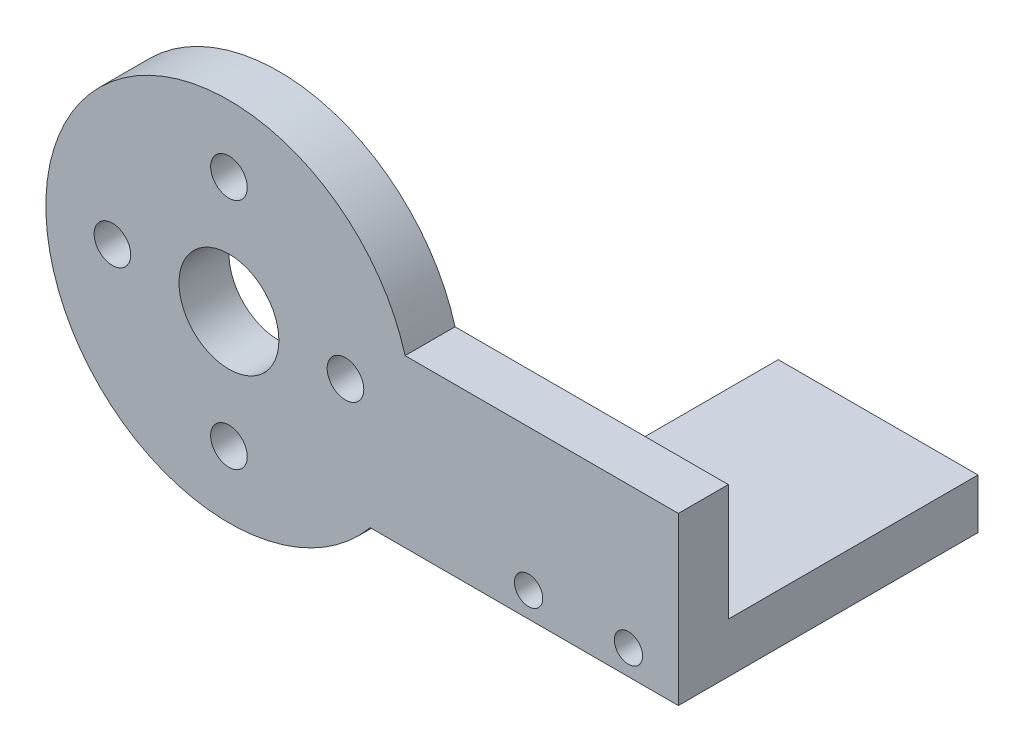
ISO-10303-21;
HEADER;
FILE_DESCRIPTION(('STEP AP214'),'2;1');
FILE_NAME('part.step','',(''),(''),'','','');
FILE_SCHEMA(('AUTOMOTIVE_DESIGN { 1 0 10303 214 1 1 1 1 }'));
ENDSEC;
DATA;
#1=APPLICATION_CONTEXT('core data for automotive mechanical design processes');
#2=APPLICATION_PROTOCOL_DEFINITION('international standard','automotive_design',2000,#1);
#3=PRODUCT_CONTEXT('',#1,'mechanical');
#4=PRODUCT('Part','Part','',(#3));
#5=PRODUCT_RELATED_PRODUCT_CATEGORY('part','',(#4));
#6=PRODUCT_DEFINITION_FORMATION('','',#4);
#7=PRODUCT_DEFINITION_CONTEXT('part definition',#1,'design');
#8=PRODUCT_DEFINITION('design','',#6,#7);
#9=PRODUCT_DEFINITION_SHAPE('','',#8);
#10=(LENGTH_UNIT() NAMED_UNIT(*) SI_UNIT(.MILLI.,.METRE.));
#11=(NAMED_UNIT(*) PLANE_ANGLE_UNIT() SI_UNIT($,.RADIAN.));
#12=(NAMED_UNIT(*) SI_UNIT($,.STERADIAN.) SOLID_ANGLE_UNIT());
#13=UNCERTAINTY_MEASURE_WITH_UNIT(LENGTH_MEASURE(1.E-05),#10,'distance_accuracy_value','');
#14=(GEOMETRIC_REPRESENTATION_CONTEXT(3) GLOBAL_UNCERTAINTY_ASSIGNED_CONTEXT((#13)) GLOBAL_UNIT_ASSIGNED_CONTEXT((#10,
#11,#12)) REPRESENTATION_CONTEXT('',''));
#15=CARTESIAN_POINT('',(0.,0.,0.));
#16=DIRECTION('',(0.,0.,1.));
#17=DIRECTION('',(1.,0.,0.));
#18=AXIS2_PLACEMENT_3D('',#15,#16,#17);
#19=CARTESIAN_POINT('',(0.,0.,15.));
#20=DIRECTION('',(0.,0.,1.));
#21=DIRECTION('',(1.,0.,0.));
#22=AXIS2_PLACEMENT_3D('',#19,#20,#21);
#23=PLANE('',#22);
#24=CARTESIAN_POINT('',(0.,-7.,15.));
#25=DIRECTION('',(0.,0.,1.));
#26=DIRECTION('',(1.,0.,0.));
#27=AXIS2_PLACEMENT_3D('',#24,#25,#26);
#28=CIRCLE('',#27,1.1);
#29=CARTESIAN_POINT('',(1.1,-7.,15.));
#30=VERTEX_POINT('',#29);
#31=EDGE_CURVE('E233',#30,#30,#28,.F.);
#32=ORIENTED_EDGE('',*,*,#31,.F.);
#33=EDGE_LOOP('',(#32));
#34=FACE_BOUND('',#33,.T.);
#35=CARTESIAN_POINT('',(0.,7.,15.));
#36=DIRECTION('',(0.,0.,1.));
#37=DIRECTION('',(1.,0.,0.));
#38=AXIS2_PLACEMENT_3D('',#35,#36,#37);
#39=CIRCLE('',#38,1.1);
#40=CARTESIAN_POINT('',(1.1,7.,15.));
#41=VERTEX_POINT('',#40);
#42=EDGE_CURVE('E227',#41,#41,#39,.F.);
#43=ORIENTED_EDGE('',*,*,#42,.F.);
#44=EDGE_LOOP('',(#43));
#45=FACE_BOUND('',#44,.T.);
#46=CARTESIAN_POINT('',(-7.,0.,15.));
#47=DIRECTION('',(0.,0.,1.));
#48=DIRECTION('',(1.,0.,0.));
#49=AXIS2_PLACEMENT_3D('',#46,#47,#48);
#50=CIRCLE('',#49,1.1);
#51=CARTESIAN_POINT('',(-5.9,0.,15.));
#52=VERTEX_POINT('',#51);
#53=EDGE_CURVE('E229',#52,#52,#50,.F.);
#54=ORIENTED_EDGE('',*,*,#53,.F.);
#55=EDGE_LOOP('',(#54));
#56=FACE_BOUND('',#55,.T.);
#57=CARTESIAN_POINT('',(7.,0.,15.));
#58=DIRECTION('',(0.,0.,1.));
#59=DIRECTION('',(1.,0.,0.));
#60=AXIS2_PLACEMENT_3D('',#57,#58,#59);
#61=CIRCLE('',#60,1.1);
#62=CARTESIAN_POINT('',(8.1,0.,15.));
#63=VERTEX_POINT('',#62);
#64=EDGE_CURVE('E211',#63,#63,#61,.F.);
#65=ORIENTED_EDGE('',*,*,#64,.F.);
#66=EDGE_LOOP('',(#65));
#67=FACE_BOUND('',#66,.T.);
#68=CARTESIAN_POINT('',(0.,0.,15.));
#69=DIRECTION('',(0.,0.,1.));
#70=DIRECTION('',(1.,0.,0.));
#71=AXIS2_PLACEMENT_3D('',#68,#69,#70);
#72=CIRCLE('',#71,3.);
#73=CARTESIAN_POINT('',(3.,0.,15.));
#74=VERTEX_POINT('',#73);
#75=EDGE_CURVE('E128',#74,#74,#72,.F.);
#76=ORIENTED_EDGE('',*,*,#75,.F.);
#77=EDGE_LOOP('',(#76));
#78=FACE_BOUND('',#77,.T.);
#79=DIRECTION('',(0.,1.,0.));
#80=VECTOR('',#79,1.);
#81=CARTESIAN_POINT('',(15.,0.,15.));
#82=LINE('',#81,#80);
#83=CARTESIAN_POINT('',(15.,-7.,15.));
#84=VERTEX_POINT('',#83);
#85=CARTESIAN_POINT('',(15.,-4.,15.));
#86=VERTEX_POINT('',#85);
#87=EDGE_CURVE('E11',#84,#86,#82,.T.);
#88=ORIENTED_EDGE('',*,*,#87,.F.);
#89=DIRECTION('',(1.,0.,0.));
#90=VECTOR('',#89,1.);
#91=CARTESIAN_POINT('',(0.,-7.,15.));
#92=LINE('',#91,#90);
#93=CARTESIAN_POINT('',(8.48528137423857,-7.,15.));
#94=VERTEX_POINT('',#93);
#95=EDGE_CURVE('E109',#94,#84,#92,.T.);
#96=ORIENTED_EDGE('',*,*,#95,.F.);
#97=CARTESIAN_POINT('',(0.,0.,15.));
#98=DIRECTION('',(0.,0.,1.));
#99=DIRECTION('',(1.,0.,0.));
#100=AXIS2_PLACEMENT_3D('',#97,#98,#99);
#101=CIRCLE('',#100,11.);
#102=CARTESIAN_POINT('',(10.5830052442584,3.,15.));
#103=VERTEX_POINT('',#102);
#104=EDGE_CURVE('E177',#103,#94,#101,.T.);
#105=ORIENTED_EDGE('',*,*,#104,.F.);
#106=DIRECTION('',(-1.,0.,0.));
#107=VECTOR('',#106,1.);
#108=CARTESIAN_POINT('',(0.,3.,15.));
#109=LINE('',#108,#107);
#110=CARTESIAN_POINT('',(27.,3.,15.));
#111=VERTEX_POINT('',#110);
#112=EDGE_CURVE('E151',#111,#103,#109,.T.);
#113=ORIENTED_EDGE('',*,*,#112,.F.);
#114=DIRECTION('',(0.,1.,0.));
#115=VECTOR('',#114,1.);
#116=CARTESIAN_POINT('',(27.,-7.,15.));
#117=LINE('',#116,#115);
#118=CARTESIAN_POINT('',(27.,-4.,15.));
#119=VERTEX_POINT('',#118);
#120=EDGE_CURVE('E161',#119,#111,#117,.T.);
#121=ORIENTED_EDGE('',*,*,#120,.F.);
#122=DIRECTION('',(1.,0.,0.));
#123=VECTOR('',#122,1.);
#124=CARTESIAN_POINT('',(0.,-4.,15.));
#125=LINE('',#124,#123);
#126=EDGE_CURVE('E54',#86,#119,#125,.T.);
#127=ORIENTED_EDGE('',*,*,#126,.F.);
#128=EDGE_LOOP('',(#88,#96,#105,#113,#121,#127));
#129=FACE_BOUND('',#128,.T.);
#130=ADVANCED_FACE('F44',(#34,#45,#56,#67,#78,#129),#23,.F.);
#131=CARTESIAN_POINT('',(0.,0.,18.));
#132=DIRECTION('',(0.,0.,-1.));
#133=DIRECTION('',(-1.,0.,0.));
#134=AXIS2_PLACEMENT_3D('',#131,#132,#133);
#135=CYLINDRICAL_SURFACE('',#134,11.);
#136=DIRECTION('',(0.,0.,-1.));
#137=VECTOR('',#136,1.);
#138=CARTESIAN_POINT('',(8.48528137423857,-7.,18.));
#139=LINE('',#138,#137);
#140=CARTESIAN_POINT('',(8.48528137423857,-7.,18.));
#141=VERTEX_POINT('',#140);
#142=EDGE_CURVE('E176',#141,#94,#139,.T.);
#143=ORIENTED_EDGE('',*,*,#142,.F.);
#144=CARTESIAN_POINT('',(0.,0.,18.));
#145=DIRECTION('',(0.,0.,1.));
#146=DIRECTION('',(1.,0.,0.));
#147=AXIS2_PLACEMENT_3D('',#144,#145,#146);
#148=CIRCLE('',#147,11.);
#149=CARTESIAN_POINT('',(10.5830052442584,3.,18.));
#150=VERTEX_POINT('',#149);
#151=EDGE_CURVE('E182',#150,#141,#148,.T.);
#152=ORIENTED_EDGE('',*,*,#151,.F.);
#153=DIRECTION('',(0.,0.,-1.));
#154=VECTOR('',#153,1.);
#155=CARTESIAN_POINT('',(10.5830052442584,3.,18.));
#156=LINE('',#155,#154);
#157=EDGE_CURVE('E175',#103,#150,#156,.F.);
#158=ORIENTED_EDGE('',*,*,#157,.F.);
#159=ORIENTED_EDGE('',*,*,#104,.T.);
#160=EDGE_LOOP('',(#143,#152,#158,#159));
#161=FACE_BOUND('',#160,.T.);
#162=ADVANCED_FACE('F50',(#161),#135,.T.);
#163=CARTESIAN_POINT('',(0.,0.,18.));
#164=DIRECTION('',(0.,0.,1.));
#165=DIRECTION('',(1.,0.,0.));
#166=AXIS2_PLACEMENT_3D('',#163,#164,#165);
#167=PLANE('',#166);
#168=CARTESIAN_POINT('',(18.,-5.5,18.));
#169=DIRECTION('',(0.,0.,1.));
#170=DIRECTION('',(1.,0.,0.));
#171=AXIS2_PLACEMENT_3D('',#168,#169,#170);
#172=CIRCLE('',#171,0.85);
#173=CARTESIAN_POINT('',(18.85,-5.5,18.));
#174=VERTEX_POINT('',#173);
#175=EDGE_CURVE('E194',#174,#174,#172,.T.);
#176=ORIENTED_EDGE('',*,*,#175,.F.);
#177=EDGE_LOOP('',(#176));
#178=FACE_BOUND('',#177,.T.);
#179=CARTESIAN_POINT('',(24.,-5.5,18.));
#180=DIRECTION('',(0.,0.,1.));
#181=DIRECTION('',(1.,0.,0.));
#182=AXIS2_PLACEMENT_3D('',#179,#180,#181);
#183=CIRCLE('',#182,0.85);
#184=CARTESIAN_POINT('',(24.85,-5.5,18.));
#185=VERTEX_POINT('',#184);
#186=EDGE_CURVE('E200',#185,#185,#183,.T.);
#187=ORIENTED_EDGE('',*,*,#186,.F.);
#188=EDGE_LOOP('',(#187));
#189=FACE_BOUND('',#188,.T.);
#190=CARTESIAN_POINT('',(0.,-7.,18.));
#191=DIRECTION('',(0.,0.,1.));
#192=DIRECTION('',(1.,0.,0.));
#193=AXIS2_PLACEMENT_3D('',#190,#191,#192);
#194=CIRCLE('',#193,1.1);
#195=CARTESIAN_POINT('',(1.1,-7.,18.));
#196=VERTEX_POINT('',#195);
#197=EDGE_CURVE('E210',#196,#196,#194,.T.);
#198=ORIENTED_EDGE('',*,*,#197,.F.);
#199=EDGE_LOOP('',(#198));
#200=FACE_BOUND('',#199,.T.);
#201=CARTESIAN_POINT('',(0.,7.,18.));
#202=DIRECTION('',(0.,0.,1.));
#203=DIRECTION('',(1.,0.,0.));
#204=AXIS2_PLACEMENT_3D('',#201,#202,#203);
#205=CIRCLE('',#204,1.1);
#206=CARTESIAN_POINT('',(1.1,7.,18.));
#207=VERTEX_POINT('',#206);
#208=EDGE_CURVE('E215',#207,#207,#205,.T.);
#209=ORIENTED_EDGE('',*,*,#208,.F.);
#210=EDGE_LOOP('',(#209));
#211=FACE_BOUND('',#210,.T.);
#212=CARTESIAN_POINT('',(-7.,0.,18.));
#213=DIRECTION('',(0.,0.,1.));
#214=DIRECTION('',(1.,0.,0.));
#215=AXIS2_PLACEMENT_3D('',#212,#213,#214);
#216=CIRCLE('',#215,1.1);
#217=CARTESIAN_POINT('',(-5.9,0.,18.));
#218=VERTEX_POINT('',#217);
#219=EDGE_CURVE('E216',#218,#218,#216,.T.);
#220=ORIENTED_EDGE('',*,*,#219,.F.);
#221=EDGE_LOOP('',(#220));
#222=FACE_BOUND('',#221,.T.);
#223=CARTESIAN_POINT('',(7.,0.,18.));
#224=DIRECTION('',(0.,0.,1.));
#225=DIRECTION('',(1.,0.,0.));
#226=AXIS2_PLACEMENT_3D('',#223,#224,#225);
#227=CIRCLE('',#226,1.1);
#228=CARTESIAN_POINT('',(8.1,0.,18.));
#229=VERTEX_POINT('',#228);
#230=EDGE_CURVE('E197',#229,#229,#227,.T.);
#231=ORIENTED_EDGE('',*,*,#230,.F.);
#232=EDGE_LOOP('',(#231));
#233=FACE_BOUND('',#232,.T.);
#234=CARTESIAN_POINT('',(0.,0.,18.));
#235=DIRECTION('',(0.,0.,1.));
#236=DIRECTION('',(1.,0.,0.));
#237=AXIS2_PLACEMENT_3D('',#234,#235,#236);
#238=CIRCLE('',#237,3.);
#239=CARTESIAN_POINT('',(3.,0.,18.));
#240=VERTEX_POINT('',#239);
#241=EDGE_CURVE('E133',#240,#240,#238,.T.);
#242=ORIENTED_EDGE('',*,*,#241,.F.);
#243=EDGE_LOOP('',(#242));
#244=FACE_BOUND('',#243,.T.);
#245=DIRECTION('',(1.,0.,0.));
#246=VECTOR('',#245,1.);
#247=CARTESIAN_POINT('',(0.,-7.,18.));
#248=LINE('',#247,#246);
#249=CARTESIAN_POINT('',(27.,-7.,18.));
#250=VERTEX_POINT('',#249);
#251=EDGE_CURVE('E150',#141,#250,#248,.T.);
#252=ORIENTED_EDGE('',*,*,#251,.T.);
#253=DIRECTION('',(0.,1.,0.));
#254=VECTOR('',#253,1.);
#255=CARTESIAN_POINT('',(27.,-7.,18.));
#256=LINE('',#255,#254);
#257=CARTESIAN_POINT('',(27.,3.,18.));
#258=VERTEX_POINT('',#257);
#259=EDGE_CURVE('E147',#250,#258,#256,.T.);
#260=ORIENTED_EDGE('',*,*,#259,.T.);
#261=DIRECTION('',(-1.,0.,0.));
#262=VECTOR('',#261,1.);
#263=CARTESIAN_POINT('',(0.,3.,18.));
#264=LINE('',#263,#262);
#265=EDGE_CURVE('E152',#258,#150,#264,.T.);
#266=ORIENTED_EDGE('',*,*,#265,.T.);
#267=ORIENTED_EDGE('',*,*,#151,.T.);
#268=EDGE_LOOP('',(#252,#260,#266,#267));
#269=FACE_BOUND('',#268,.T.);
#270=ADVANCED_FACE('F243',(#178,#189,#200,#211,#222,#233,#244,#269),#167,.T.);
#271=CARTESIAN_POINT('',(0.,-7.,18.));
#272=DIRECTION('',(0.,1.,0.));
#273=DIRECTION('',(0.,0.,1.));
#274=AXIS2_PLACEMENT_3D('',#271,#272,#273);
#275=PLANE('',#274);
#276=DIRECTION('',(0.,0.,-1.));
#277=VECTOR('',#276,1.);
#278=CARTESIAN_POINT('',(27.,-7.,18.));
#279=LINE('',#278,#277);
#280=CARTESIAN_POINT('',(27.,-7.,0.));
#281=VERTEX_POINT('',#280);
#282=EDGE_CURVE('E168',#250,#281,#279,.T.);
#283=ORIENTED_EDGE('',*,*,#282,.F.);
#284=ORIENTED_EDGE('',*,*,#251,.F.);
#285=ORIENTED_EDGE('',*,*,#142,.T.);
#286=ORIENTED_EDGE('',*,*,#95,.T.);
#287=DIRECTION('',(0.,0.,-1.));
#288=VECTOR('',#287,1.);
#289=CARTESIAN_POINT('',(15.,-7.,18.));
#290=LINE('',#289,#288);
#291=CARTESIAN_POINT('',(15.,-7.,0.));
#292=VERTEX_POINT('',#291);
#293=EDGE_CURVE('E103',#84,#292,#290,.T.);
#294=ORIENTED_EDGE('',*,*,#293,.T.);
#295=DIRECTION('',(1.,0.,0.));
#296=VECTOR('',#295,1.);
#297=CARTESIAN_POINT('',(15.,-7.,0.));
#298=LINE('',#297,#296);
#299=EDGE_CURVE('E110',#292,#281,#298,.T.);
#300=ORIENTED_EDGE('',*,*,#299,.T.);
#301=EDGE_LOOP('',(#283,#284,#285,#286,#294,#300));
#302=FACE_BOUND('',#301,.T.);
#303=ADVANCED_FACE('F106',(#302),#275,.F.);
#304=CARTESIAN_POINT('',(0.,3.,18.));
#305=DIRECTION('',(0.,-1.,0.));
#306=DIRECTION('',(0.,0.,-1.));
#307=AXIS2_PLACEMENT_3D('',#304,#305,#306);
#308=PLANE('',#307);
#309=ORIENTED_EDGE('',*,*,#112,.T.);
#310=ORIENTED_EDGE('',*,*,#157,.T.);
#311=ORIENTED_EDGE('',*,*,#265,.F.);
#312=DIRECTION('',(0.,0.,-1.));
#313=VECTOR('',#312,1.);
#314=CARTESIAN_POINT('',(27.,3.,18.));
#315=LINE('',#314,#313);
#316=EDGE_CURVE('E158',#258,#111,#315,.T.);
#317=ORIENTED_EDGE('',*,*,#316,.T.);
#318=EDGE_LOOP('',(#309,#310,#311,#317));
#319=FACE_BOUND('',#318,.T.);
#320=ADVANCED_FACE('F256',(#319),#308,.F.);
#321=CARTESIAN_POINT('',(27.,-7.,18.));
#322=DIRECTION('',(-1.,0.,0.));
#323=DIRECTION('',(0.,0.,1.));
#324=AXIS2_PLACEMENT_3D('',#321,#322,#323);
#325=PLANE('',#324);
#326=ORIENTED_EDGE('',*,*,#316,.F.);
#327=ORIENTED_EDGE('',*,*,#259,.F.);
#328=ORIENTED_EDGE('',*,*,#282,.T.);
#329=DIRECTION('',(0.,1.,0.));
#330=VECTOR('',#329,1.);
#331=CARTESIAN_POINT('',(27.,-7.,0.));
#332=LINE('',#331,#330);
#333=CARTESIAN_POINT('',(27.,-4.,0.));
#334=VERTEX_POINT('',#333);
#335=EDGE_CURVE('E121',#281,#334,#332,.T.);
#336=ORIENTED_EDGE('',*,*,#335,.T.);
#337=DIRECTION('',(0.,0.,-1.));
#338=VECTOR('',#337,1.);
#339=CARTESIAN_POINT('',(27.,-4.,18.));
#340=LINE('',#339,#338);
#341=EDGE_CURVE('E111',#119,#334,#340,.T.);
#342=ORIENTED_EDGE('',*,*,#341,.F.);
#343=ORIENTED_EDGE('',*,*,#120,.T.);
#344=EDGE_LOOP('',(#326,#327,#328,#336,#342,#343));
#345=FACE_BOUND('',#344,.T.);
#346=ADVANCED_FACE('F251',(#345),#325,.F.);
#347=CARTESIAN_POINT('',(15.,-7.,18.));
#348=DIRECTION('',(1.,0.,0.));
#349=DIRECTION('',(0.,0.,-1.));
#350=AXIS2_PLACEMENT_3D('',#347,#348,#349);
#351=PLANE('',#350);
#352=ORIENTED_EDGE('',*,*,#293,.F.);
#353=ORIENTED_EDGE('',*,*,#87,.T.);
#354=DIRECTION('',(0.,0.,-1.));
#355=VECTOR('',#354,1.);
#356=CARTESIAN_POINT('',(15.,-4.,18.));
#357=LINE('',#356,#355);
#358=CARTESIAN_POINT('',(15.,-4.,0.));
#359=VERTEX_POINT('',#358);
#360=EDGE_CURVE('E130',#86,#359,#357,.T.);
#361=ORIENTED_EDGE('',*,*,#360,.T.);
#362=DIRECTION('',(0.,-1.,0.));
#363=VECTOR('',#362,1.);
#364=CARTESIAN_POINT('',(15.,-7.,0.));
#365=LINE('',#364,#363);
#366=EDGE_CURVE('E117',#359,#292,#365,.T.);
#367=ORIENTED_EDGE('',*,*,#366,.T.);
#368=EDGE_LOOP('',(#352,#353,#361,#367));
#369=FACE_BOUND('',#368,.T.);
#370=ADVANCED_FACE('F122',(#369),#351,.F.);
#371=CARTESIAN_POINT('',(15.,-4.,18.));
#372=DIRECTION('',(0.,-1.,0.));
#373=DIRECTION('',(0.,0.,-1.));
#374=AXIS2_PLACEMENT_3D('',#371,#372,#373);
#375=PLANE('',#374);
#376=ORIENTED_EDGE('',*,*,#360,.F.);
#377=ORIENTED_EDGE('',*,*,#126,.T.);
#378=ORIENTED_EDGE('',*,*,#341,.T.);
#379=DIRECTION('',(-1.,0.,0.));
#380=VECTOR('',#379,1.);
#381=CARTESIAN_POINT('',(15.,-4.,0.));
#382=LINE('',#381,#380);
#383=EDGE_CURVE('E137',#334,#359,#382,.T.);
#384=ORIENTED_EDGE('',*,*,#383,.T.);
#385=EDGE_LOOP('',(#376,#377,#378,#384));
#386=FACE_BOUND('',#385,.T.);
#387=ADVANCED_FACE('F265',(#386),#375,.F.);
#388=CARTESIAN_POINT('',(0.,0.,0.));
#389=DIRECTION('',(0.,0.,-1.));
#390=DIRECTION('',(-1.,0.,0.));
#391=AXIS2_PLACEMENT_3D('',#388,#389,#390);
#392=PLANE('',#391);
#393=CARTESIAN_POINT('',(18.,-5.5,0.));
#394=DIRECTION('',(0.,0.,-1.));
#395=DIRECTION('',(-1.,0.,0.));
#396=AXIS2_PLACEMENT_3D('',#393,#394,#395);
#397=CIRCLE('',#396,0.85);
#398=CARTESIAN_POINT('',(17.15,-5.5,0.));
#399=VERTEX_POINT('',#398);
#400=EDGE_CURVE('E47',#399,#399,#397,.F.);
#401=ORIENTED_EDGE('',*,*,#400,.T.);
#402=EDGE_LOOP('',(#401));
#403=FACE_BOUND('',#402,.T.);
#404=CARTESIAN_POINT('',(24.,-5.5,0.));
#405=DIRECTION('',(0.,0.,-1.));
#406=DIRECTION('',(-1.,0.,0.));
#407=AXIS2_PLACEMENT_3D('',#404,#405,#406);
#408=CIRCLE('',#407,0.85);
#409=CARTESIAN_POINT('',(23.15,-5.5,0.));
#410=VERTEX_POINT('',#409);
#411=EDGE_CURVE('E190',#410,#410,#408,.F.);
#412=ORIENTED_EDGE('',*,*,#411,.T.);
#413=EDGE_LOOP('',(#412));
#414=FACE_BOUND('',#413,.T.);
#415=ORIENTED_EDGE('',*,*,#366,.F.);
#416=ORIENTED_EDGE('',*,*,#383,.F.);
#417=ORIENTED_EDGE('',*,*,#335,.F.);
#418=ORIENTED_EDGE('',*,*,#299,.F.);
#419=EDGE_LOOP('',(#415,#416,#417,#418));
#420=FACE_BOUND('',#419,.T.);
#421=ADVANCED_FACE('F120',(#403,#414,#420),#392,.T.);
#422=CARTESIAN_POINT('',(0.,0.,18.));
#423=DIRECTION('',(0.,0.,-1.));
#424=DIRECTION('',(-1.,0.,0.));
#425=AXIS2_PLACEMENT_3D('',#422,#423,#424);
#426=CYLINDRICAL_SURFACE('',#425,3.);
#427=ORIENTED_EDGE('',*,*,#241,.T.);
#428=EDGE_LOOP('',(#427));
#429=FACE_BOUND('',#428,.T.);
#430=ORIENTED_EDGE('',*,*,#75,.T.);
#431=EDGE_LOOP('',(#430));
#432=FACE_BOUND('',#431,.T.);
#433=ADVANCED_FACE('F244',(#429,#432),#426,.F.);
#434=CARTESIAN_POINT('',(7.,0.,18.));
#435=DIRECTION('',(0.,0.,-1.));
#436=DIRECTION('',(-1.,0.,0.));
#437=AXIS2_PLACEMENT_3D('',#434,#435,#436);
#438=CYLINDRICAL_SURFACE('',#437,1.1);
#439=ORIENTED_EDGE('',*,*,#230,.T.);
#440=EDGE_LOOP('',(#439));
#441=FACE_BOUND('',#440,.T.);
#442=ORIENTED_EDGE('',*,*,#64,.T.);
#443=EDGE_LOOP('',(#442));
#444=FACE_BOUND('',#443,.T.);
#445=ADVANCED_FACE('F330',(#441,#444),#438,.F.);
#446=CARTESIAN_POINT('',(-7.,0.,18.));
#447=DIRECTION('',(0.,0.,-1.));
#448=DIRECTION('',(-1.,0.,0.));
#449=AXIS2_PLACEMENT_3D('',#446,#447,#448);
#450=CYLINDRICAL_SURFACE('',#449,1.1);
#451=ORIENTED_EDGE('',*,*,#219,.T.);
#452=EDGE_LOOP('',(#451));
#453=FACE_BOUND('',#452,.T.);
#454=ORIENTED_EDGE('',*,*,#53,.T.);
#455=EDGE_LOOP('',(#454));
#456=FACE_BOUND('',#455,.T.);
#457=ADVANCED_FACE('F333',(#453,#456),#450,.F.);
#458=CARTESIAN_POINT('',(0.,7.,18.));
#459=DIRECTION('',(0.,0.,-1.));
#460=DIRECTION('',(-1.,0.,0.));
#461=AXIS2_PLACEMENT_3D('',#458,#459,#460);
#462=CYLINDRICAL_SURFACE('',#461,1.1);
#463=ORIENTED_EDGE('',*,*,#208,.T.);
#464=EDGE_LOOP('',(#463));
#465=FACE_BOUND('',#464,.T.);
#466=ORIENTED_EDGE('',*,*,#42,.T.);
#467=EDGE_LOOP('',(#466));
#468=FACE_BOUND('',#467,.T.);
#469=ADVANCED_FACE('F342',(#465,#468),#462,.F.);
#470=CARTESIAN_POINT('',(0.,-7.,18.));
#471=DIRECTION('',(0.,0.,-1.));
#472=DIRECTION('',(-1.,0.,0.));
#473=AXIS2_PLACEMENT_3D('',#470,#471,#472);
#474=CYLINDRICAL_SURFACE('',#473,1.1);
#475=ORIENTED_EDGE('',*,*,#197,.T.);
#476=EDGE_LOOP('',(#475));
#477=FACE_BOUND('',#476,.T.);
#478=ORIENTED_EDGE('',*,*,#31,.T.);
#479=EDGE_LOOP('',(#478));
#480=FACE_BOUND('',#479,.T.);
#481=ADVANCED_FACE('F352',(#477,#480),#474,.F.);
#482=CARTESIAN_POINT('',(24.,-5.5,18.));
#483=DIRECTION('',(0.,0.,-1.));
#484=DIRECTION('',(-1.,0.,0.));
#485=AXIS2_PLACEMENT_3D('',#482,#483,#484);
#486=CYLINDRICAL_SURFACE('',#485,0.85);
#487=ORIENTED_EDGE('',*,*,#411,.F.);
#488=EDGE_LOOP('',(#487));
#489=FACE_BOUND('',#488,.T.);
#490=ORIENTED_EDGE('',*,*,#186,.T.);
#491=EDGE_LOOP('',(#490));
#492=FACE_BOUND('',#491,.T.);
#493=ADVANCED_FACE('F364',(#489,#492),#486,.F.);
#494=CARTESIAN_POINT('',(18.,-5.5,18.));
#495=DIRECTION('',(0.,0.,-1.));
#496=DIRECTION('',(-1.,0.,0.));
#497=AXIS2_PLACEMENT_3D('',#494,#495,#496);
#498=CYLINDRICAL_SURFACE('',#497,0.85);
#499=ORIENTED_EDGE('',*,*,#400,.F.);
#500=EDGE_LOOP('',(#499));
#501=FACE_BOUND('',#500,.T.);
#502=ORIENTED_EDGE('',*,*,#175,.T.);
#503=EDGE_LOOP('',(#502));
#504=FACE_BOUND('',#503,.T.);
#505=ADVANCED_FACE('F372',(#501,#504),#498,.F.);
#506=CLOSED_SHELL('',(#130,#162,#270,#303,#320,#346,#370,#387,#421,#433,#445,#457,#469,#481,
#493,#505));
#507=MANIFOLD_SOLID_BREP('B2',#506);
#508=ADVANCED_BREP_SHAPE_REPRESENTATION('',(#18,#507),#14);
#509=SHAPE_DEFINITION_REPRESENTATION(#9,#508);
ENDSEC;
END-ISO-10303-21;
